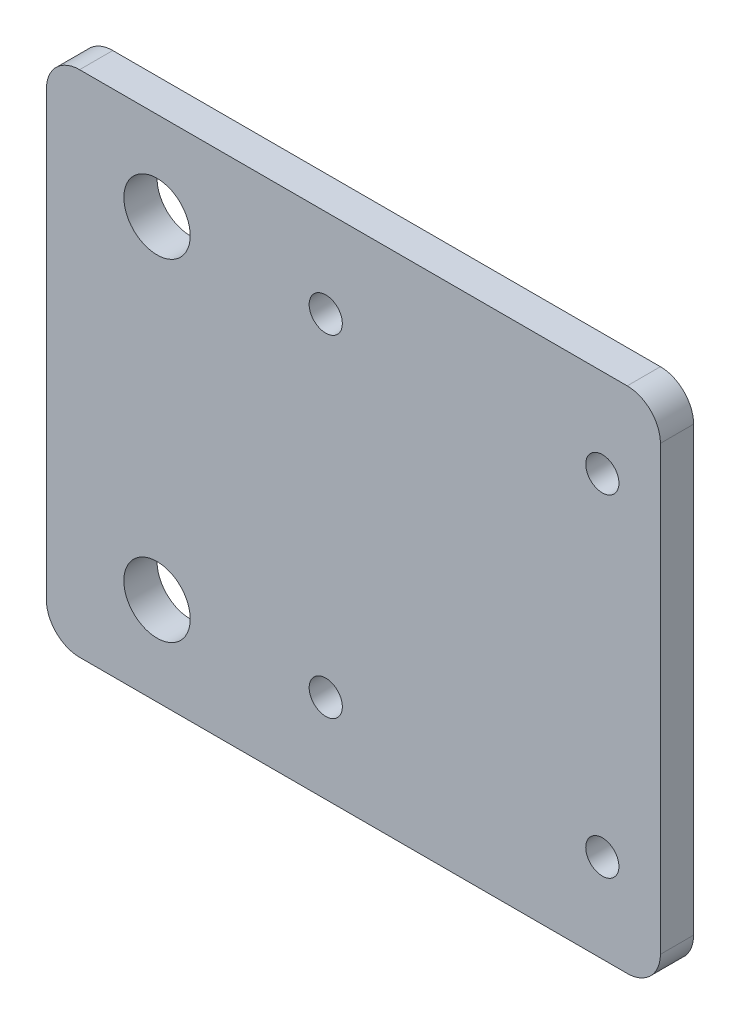
ISO-10303-21;
HEADER;
FILE_DESCRIPTION(('STEP AP214'),'2;1');
FILE_NAME('part.step','',(''),(''),'','','');
FILE_SCHEMA(('AUTOMOTIVE_DESIGN { 1 0 10303 214 1 1 1 1 }'));
ENDSEC;
DATA;
#1=APPLICATION_CONTEXT('core data for automotive mechanical design processes');
#2=APPLICATION_PROTOCOL_DEFINITION('international standard','automotive_design',2000,#1);
#3=PRODUCT_CONTEXT('',#1,'mechanical');
#4=PRODUCT('Part','Part','',(#3));
#5=PRODUCT_RELATED_PRODUCT_CATEGORY('part','',(#4));
#6=PRODUCT_DEFINITION_FORMATION('','',#4);
#7=PRODUCT_DEFINITION_CONTEXT('part definition',#1,'design');
#8=PRODUCT_DEFINITION('design','',#6,#7);
#9=PRODUCT_DEFINITION_SHAPE('','',#8);
#10=(LENGTH_UNIT() NAMED_UNIT(*) SI_UNIT(.MILLI.,.METRE.));
#11=(NAMED_UNIT(*) PLANE_ANGLE_UNIT() SI_UNIT($,.RADIAN.));
#12=(NAMED_UNIT(*) SI_UNIT($,.STERADIAN.) SOLID_ANGLE_UNIT());
#13=UNCERTAINTY_MEASURE_WITH_UNIT(LENGTH_MEASURE(1.E-05),#10,'distance_accuracy_value','');
#14=(GEOMETRIC_REPRESENTATION_CONTEXT(3) GLOBAL_UNCERTAINTY_ASSIGNED_CONTEXT((#13)) GLOBAL_UNIT_ASSIGNED_CONTEXT((#10,
#11,#12)) REPRESENTATION_CONTEXT('',''));
#15=CARTESIAN_POINT('',(0.,0.,0.));
#16=DIRECTION('',(0.,0.,1.));
#17=DIRECTION('',(1.,0.,0.));
#18=AXIS2_PLACEMENT_3D('',#15,#16,#17);
#19=CARTESIAN_POINT('',(4.46441751946896,26.2513791285018,3.));
#20=DIRECTION('',(0.,0.,-1.));
#21=DIRECTION('',(-1.,0.,0.));
#22=AXIS2_PLACEMENT_3D('',#19,#20,#21);
#23=PLANE('',#22);
#24=CARTESIAN_POINT('',(4.46441751946896,26.2513791285018,3.));
#25=DIRECTION('',(0.,0.,1.));
#26=DIRECTION('',(-1.,0.,0.));
#27=AXIS2_PLACEMENT_3D('',#24,#25,#26);
#28=CIRCLE('',#27,3.);
#29=CARTESIAN_POINT('',(4.46441751946898,29.2513791285018,3.));
#30=VERTEX_POINT('',#29);
#31=CARTESIAN_POINT('',(1.46441751946896,26.2513791285018,3.));
#32=VERTEX_POINT('',#31);
#33=EDGE_CURVE('E153',#30,#32,#28,.T.);
#34=ORIENTED_EDGE('',*,*,#33,.T.);
#35=DIRECTION('',(0.,-1.,0.));
#36=VECTOR('',#35,1.);
#37=CARTESIAN_POINT('',(1.46441751946896,26.2513791285018,3.));
#38=LINE('',#37,#36);
#39=CARTESIAN_POINT('',(1.46441751946897,-13.7486208714982,3.));
#40=VERTEX_POINT('',#39);
#41=EDGE_CURVE('E101',#32,#40,#38,.T.);
#42=ORIENTED_EDGE('',*,*,#41,.T.);
#43=CARTESIAN_POINT('',(4.46441751946897,-13.7486208714982,3.));
#44=DIRECTION('',(0.,0.,1.));
#45=DIRECTION('',(1.,0.,0.));
#46=AXIS2_PLACEMENT_3D('',#43,#44,#45);
#47=CIRCLE('',#46,3.);
#48=CARTESIAN_POINT('',(4.46441751946897,-16.7486208714982,3.));
#49=VERTEX_POINT('',#48);
#50=EDGE_CURVE('E168',#40,#49,#47,.T.);
#51=ORIENTED_EDGE('',*,*,#50,.T.);
#52=DIRECTION('',(1.,0.,0.));
#53=VECTOR('',#52,1.);
#54=CARTESIAN_POINT('',(4.46441751946897,-16.7486208714982,3.));
#55=LINE('',#54,#53);
#56=CARTESIAN_POINT('',(53.9644175194689,-16.7486208714982,3.));
#57=VERTEX_POINT('',#56);
#58=EDGE_CURVE('E181',#49,#57,#55,.T.);
#59=ORIENTED_EDGE('',*,*,#58,.T.);
#60=CARTESIAN_POINT('',(53.964417519469,-13.7486208714982,3.));
#61=DIRECTION('',(0.,0.,1.));
#62=DIRECTION('',(1.,0.,0.));
#63=AXIS2_PLACEMENT_3D('',#60,#61,#62);
#64=CIRCLE('',#63,3.);
#65=CARTESIAN_POINT('',(56.964417519469,-13.7486208714982,3.));
#66=VERTEX_POINT('',#65);
#67=EDGE_CURVE('E120',#57,#66,#64,.T.);
#68=ORIENTED_EDGE('',*,*,#67,.T.);
#69=DIRECTION('',(0.,1.,0.));
#70=VECTOR('',#69,1.);
#71=CARTESIAN_POINT('',(56.964417519469,-13.7486208714982,3.));
#72=LINE('',#71,#70);
#73=CARTESIAN_POINT('',(56.964417519469,26.2513791285018,3.));
#74=VERTEX_POINT('',#73);
#75=EDGE_CURVE('E114',#66,#74,#72,.T.);
#76=ORIENTED_EDGE('',*,*,#75,.T.);
#77=CARTESIAN_POINT('',(53.964417519469,26.2513791285018,3.));
#78=DIRECTION('',(0.,0.,1.));
#79=DIRECTION('',(1.,0.,0.));
#80=AXIS2_PLACEMENT_3D('',#77,#78,#79);
#81=CIRCLE('',#80,3.);
#82=CARTESIAN_POINT('',(53.9644175194689,29.2513791285018,3.));
#83=VERTEX_POINT('',#82);
#84=EDGE_CURVE('E118',#74,#83,#81,.T.);
#85=ORIENTED_EDGE('',*,*,#84,.T.);
#86=DIRECTION('',(-1.,0.,0.));
#87=VECTOR('',#86,1.);
#88=CARTESIAN_POINT('',(53.9644175194689,29.2513791285018,3.));
#89=LINE('',#88,#87);
#90=EDGE_CURVE('E58',#83,#30,#89,.T.);
#91=ORIENTED_EDGE('',*,*,#90,.T.);
#92=EDGE_LOOP('',(#34,#42,#51,#59,#68,#76,#85,#91));
#93=FACE_BOUND('',#92,.T.);
#94=CARTESIAN_POINT('',(51.714417519469,21.2513791285018,3.));
#95=DIRECTION('',(0.,0.,1.));
#96=DIRECTION('',(1.,0.,0.));
#97=AXIS2_PLACEMENT_3D('',#94,#95,#96);
#98=CIRCLE('',#97,1.5);
#99=CARTESIAN_POINT('',(53.214417519469,21.2513791285018,3.));
#100=VERTEX_POINT('',#99);
#101=EDGE_CURVE('E142',#100,#100,#98,.T.);
#102=ORIENTED_EDGE('',*,*,#101,.F.);
#103=EDGE_LOOP('',(#102));
#104=FACE_BOUND('',#103,.T.);
#105=CARTESIAN_POINT('',(26.714417519469,21.2513791285018,3.));
#106=DIRECTION('',(0.,0.,1.));
#107=DIRECTION('',(1.,0.,0.));
#108=AXIS2_PLACEMENT_3D('',#105,#106,#107);
#109=CIRCLE('',#108,1.5);
#110=CARTESIAN_POINT('',(28.214417519469,21.2513791285018,3.));
#111=VERTEX_POINT('',#110);
#112=EDGE_CURVE('E190',#111,#111,#109,.T.);
#113=ORIENTED_EDGE('',*,*,#112,.F.);
#114=EDGE_LOOP('',(#113));
#115=FACE_BOUND('',#114,.T.);
#116=CARTESIAN_POINT('',(26.714417519469,-8.74862087149821,3.));
#117=DIRECTION('',(0.,0.,1.));
#118=DIRECTION('',(-1.,0.,0.));
#119=AXIS2_PLACEMENT_3D('',#116,#117,#118);
#120=CIRCLE('',#119,1.5);
#121=CARTESIAN_POINT('',(25.214417519469,-8.74862087149821,3.));
#122=VERTEX_POINT('',#121);
#123=EDGE_CURVE('E196',#122,#122,#120,.T.);
#124=ORIENTED_EDGE('',*,*,#123,.F.);
#125=EDGE_LOOP('',(#124));
#126=FACE_BOUND('',#125,.T.);
#127=CARTESIAN_POINT('',(51.714417519469,-8.74862087149821,3.));
#128=DIRECTION('',(0.,0.,1.));
#129=DIRECTION('',(-1.,0.,0.));
#130=AXIS2_PLACEMENT_3D('',#127,#128,#129);
#131=CIRCLE('',#130,1.5);
#132=CARTESIAN_POINT('',(50.214417519469,-8.74862087149821,3.));
#133=VERTEX_POINT('',#132);
#134=EDGE_CURVE('E202',#133,#133,#131,.T.);
#135=ORIENTED_EDGE('',*,*,#134,.F.);
#136=EDGE_LOOP('',(#135));
#137=FACE_BOUND('',#136,.T.);
#138=CARTESIAN_POINT('',(11.464417519469,21.2513791285018,3.));
#139=DIRECTION('',(0.,0.,1.));
#140=DIRECTION('',(1.,0.,0.));
#141=AXIS2_PLACEMENT_3D('',#138,#139,#140);
#142=CIRCLE('',#141,3.);
#143=CARTESIAN_POINT('',(14.464417519469,21.2513791285018,3.));
#144=VERTEX_POINT('',#143);
#145=EDGE_CURVE('E208',#144,#144,#142,.T.);
#146=ORIENTED_EDGE('',*,*,#145,.F.);
#147=EDGE_LOOP('',(#146));
#148=FACE_BOUND('',#147,.T.);
#149=CARTESIAN_POINT('',(11.464417519469,-8.74862087149821,3.));
#150=DIRECTION('',(0.,0.,1.));
#151=DIRECTION('',(-1.,0.,0.));
#152=AXIS2_PLACEMENT_3D('',#149,#150,#151);
#153=CIRCLE('',#152,3.);
#154=CARTESIAN_POINT('',(8.46441751946896,-8.74862087149821,3.));
#155=VERTEX_POINT('',#154);
#156=EDGE_CURVE('E214',#155,#155,#153,.T.);
#157=ORIENTED_EDGE('',*,*,#156,.F.);
#158=EDGE_LOOP('',(#157));
#159=FACE_BOUND('',#158,.T.);
#160=ADVANCED_FACE('F41',(#93,#104,#115,#126,#137,#148,#159),#23,.F.);
#161=CARTESIAN_POINT('',(4.46441751946896,26.2513791285018,0.));
#162=DIRECTION('',(0.,0.,-1.));
#163=DIRECTION('',(-1.,0.,0.));
#164=AXIS2_PLACEMENT_3D('',#161,#162,#163);
#165=PLANE('',#164);
#166=CARTESIAN_POINT('',(11.464417519469,21.2513791285018,0.));
#167=DIRECTION('',(0.,0.,1.));
#168=DIRECTION('',(1.,0.,0.));
#169=AXIS2_PLACEMENT_3D('',#166,#167,#168);
#170=CIRCLE('',#169,3.);
#171=CARTESIAN_POINT('',(14.464417519469,21.2513791285018,0.));
#172=VERTEX_POINT('',#171);
#173=EDGE_CURVE('E211',#172,#172,#170,.T.);
#174=ORIENTED_EDGE('',*,*,#173,.T.);
#175=EDGE_LOOP('',(#174));
#176=FACE_BOUND('',#175,.T.);
#177=CARTESIAN_POINT('',(26.714417519469,-8.74862087149821,0.));
#178=DIRECTION('',(0.,0.,1.));
#179=DIRECTION('',(-1.,0.,0.));
#180=AXIS2_PLACEMENT_3D('',#177,#178,#179);
#181=CIRCLE('',#180,1.5);
#182=CARTESIAN_POINT('',(25.214417519469,-8.74862087149821,0.));
#183=VERTEX_POINT('',#182);
#184=EDGE_CURVE('E199',#183,#183,#181,.T.);
#185=ORIENTED_EDGE('',*,*,#184,.T.);
#186=EDGE_LOOP('',(#185));
#187=FACE_BOUND('',#186,.T.);
#188=CARTESIAN_POINT('',(51.714417519469,21.2513791285018,0.));
#189=DIRECTION('',(0.,0.,1.));
#190=DIRECTION('',(1.,0.,0.));
#191=AXIS2_PLACEMENT_3D('',#188,#189,#190);
#192=CIRCLE('',#191,1.5);
#193=CARTESIAN_POINT('',(53.214417519469,21.2513791285018,0.));
#194=VERTEX_POINT('',#193);
#195=EDGE_CURVE('E187',#194,#194,#192,.T.);
#196=ORIENTED_EDGE('',*,*,#195,.T.);
#197=EDGE_LOOP('',(#196));
#198=FACE_BOUND('',#197,.T.);
#199=CARTESIAN_POINT('',(4.46441751946896,26.2513791285018,0.));
#200=DIRECTION('',(0.,0.,1.));
#201=DIRECTION('',(-1.,0.,0.));
#202=AXIS2_PLACEMENT_3D('',#199,#200,#201);
#203=CIRCLE('',#202,3.);
#204=CARTESIAN_POINT('',(4.46441751946898,29.2513791285018,0.));
#205=VERTEX_POINT('',#204);
#206=CARTESIAN_POINT('',(1.46441751946896,26.2513791285018,0.));
#207=VERTEX_POINT('',#206);
#208=EDGE_CURVE('E138',#205,#207,#203,.T.);
#209=ORIENTED_EDGE('',*,*,#208,.F.);
#210=DIRECTION('',(-1.,0.,0.));
#211=VECTOR('',#210,1.);
#212=CARTESIAN_POINT('',(53.9644175194689,29.2513791285018,0.));
#213=LINE('',#212,#211);
#214=CARTESIAN_POINT('',(53.9644175194689,29.2513791285018,0.));
#215=VERTEX_POINT('',#214);
#216=EDGE_CURVE('E93',#215,#205,#213,.T.);
#217=ORIENTED_EDGE('',*,*,#216,.F.);
#218=CARTESIAN_POINT('',(53.964417519469,26.2513791285018,0.));
#219=DIRECTION('',(0.,0.,1.));
#220=DIRECTION('',(1.,0.,0.));
#221=AXIS2_PLACEMENT_3D('',#218,#219,#220);
#222=CIRCLE('',#221,3.);
#223=CARTESIAN_POINT('',(56.964417519469,26.2513791285018,0.));
#224=VERTEX_POINT('',#223);
#225=EDGE_CURVE('E87',#224,#215,#222,.T.);
#226=ORIENTED_EDGE('',*,*,#225,.F.);
#227=DIRECTION('',(0.,1.,0.));
#228=VECTOR('',#227,1.);
#229=CARTESIAN_POINT('',(56.964417519469,-13.7486208714982,0.));
#230=LINE('',#229,#228);
#231=CARTESIAN_POINT('',(56.964417519469,-13.7486208714982,0.));
#232=VERTEX_POINT('',#231);
#233=EDGE_CURVE('E128',#232,#224,#230,.T.);
#234=ORIENTED_EDGE('',*,*,#233,.F.);
#235=CARTESIAN_POINT('',(53.964417519469,-13.7486208714982,0.));
#236=DIRECTION('',(0.,0.,1.));
#237=DIRECTION('',(1.,0.,0.));
#238=AXIS2_PLACEMENT_3D('',#235,#236,#237);
#239=CIRCLE('',#238,3.);
#240=CARTESIAN_POINT('',(53.9644175194689,-16.7486208714982,0.));
#241=VERTEX_POINT('',#240);
#242=EDGE_CURVE('E148',#241,#232,#239,.T.);
#243=ORIENTED_EDGE('',*,*,#242,.F.);
#244=DIRECTION('',(1.,0.,0.));
#245=VECTOR('',#244,1.);
#246=CARTESIAN_POINT('',(4.46441751946897,-16.7486208714982,0.));
#247=LINE('',#246,#245);
#248=CARTESIAN_POINT('',(4.46441751946897,-16.7486208714982,0.));
#249=VERTEX_POINT('',#248);
#250=EDGE_CURVE('E146',#249,#241,#247,.T.);
#251=ORIENTED_EDGE('',*,*,#250,.F.);
#252=CARTESIAN_POINT('',(4.46441751946897,-13.7486208714982,0.));
#253=DIRECTION('',(0.,0.,1.));
#254=DIRECTION('',(1.,0.,0.));
#255=AXIS2_PLACEMENT_3D('',#252,#253,#254);
#256=CIRCLE('',#255,3.);
#257=CARTESIAN_POINT('',(1.46441751946897,-13.7486208714982,0.));
#258=VERTEX_POINT('',#257);
#259=EDGE_CURVE('E144',#258,#249,#256,.T.);
#260=ORIENTED_EDGE('',*,*,#259,.F.);
#261=DIRECTION('',(0.,-1.,0.));
#262=VECTOR('',#261,1.);
#263=CARTESIAN_POINT('',(1.46441751946896,26.2513791285018,0.));
#264=LINE('',#263,#262);
#265=EDGE_CURVE('E141',#207,#258,#264,.T.);
#266=ORIENTED_EDGE('',*,*,#265,.F.);
#267=EDGE_LOOP('',(#209,#217,#226,#234,#243,#251,#260,#266));
#268=FACE_BOUND('',#267,.T.);
#269=CARTESIAN_POINT('',(26.714417519469,21.2513791285018,0.));
#270=DIRECTION('',(0.,0.,1.));
#271=DIRECTION('',(1.,0.,0.));
#272=AXIS2_PLACEMENT_3D('',#269,#270,#271);
#273=CIRCLE('',#272,1.5);
#274=CARTESIAN_POINT('',(28.214417519469,21.2513791285018,0.));
#275=VERTEX_POINT('',#274);
#276=EDGE_CURVE('E193',#275,#275,#273,.T.);
#277=ORIENTED_EDGE('',*,*,#276,.T.);
#278=EDGE_LOOP('',(#277));
#279=FACE_BOUND('',#278,.T.);
#280=CARTESIAN_POINT('',(51.714417519469,-8.74862087149821,0.));
#281=DIRECTION('',(0.,0.,1.));
#282=DIRECTION('',(-1.,0.,0.));
#283=AXIS2_PLACEMENT_3D('',#280,#281,#282);
#284=CIRCLE('',#283,1.5);
#285=CARTESIAN_POINT('',(50.214417519469,-8.74862087149821,0.));
#286=VERTEX_POINT('',#285);
#287=EDGE_CURVE('E205',#286,#286,#284,.T.);
#288=ORIENTED_EDGE('',*,*,#287,.T.);
#289=EDGE_LOOP('',(#288));
#290=FACE_BOUND('',#289,.T.);
#291=CARTESIAN_POINT('',(11.464417519469,-8.74862087149821,0.));
#292=DIRECTION('',(0.,0.,1.));
#293=DIRECTION('',(-1.,0.,0.));
#294=AXIS2_PLACEMENT_3D('',#291,#292,#293);
#295=CIRCLE('',#294,3.);
#296=CARTESIAN_POINT('',(8.46441751946896,-8.74862087149821,0.));
#297=VERTEX_POINT('',#296);
#298=EDGE_CURVE('E217',#297,#297,#295,.T.);
#299=ORIENTED_EDGE('',*,*,#298,.T.);
#300=EDGE_LOOP('',(#299));
#301=FACE_BOUND('',#300,.T.);
#302=ADVANCED_FACE('F172',(#176,#187,#198,#268,#279,#290,#301),#165,.T.);
#303=CARTESIAN_POINT('',(4.46441751946896,26.2513791285018,3.));
#304=DIRECTION('',(0.,0.,-1.));
#305=DIRECTION('',(-1.,0.,0.));
#306=AXIS2_PLACEMENT_3D('',#303,#304,#305);
#307=CYLINDRICAL_SURFACE('',#306,3.);
#308=ORIENTED_EDGE('',*,*,#208,.T.);
#309=DIRECTION('',(0.,0.,-1.));
#310=VECTOR('',#309,1.);
#311=CARTESIAN_POINT('',(1.46441751946896,26.2513791285018,3.));
#312=LINE('',#311,#310);
#313=EDGE_CURVE('E11',#32,#207,#312,.T.);
#314=ORIENTED_EDGE('',*,*,#313,.F.);
#315=ORIENTED_EDGE('',*,*,#33,.F.);
#316=DIRECTION('',(0.,0.,-1.));
#317=VECTOR('',#316,1.);
#318=CARTESIAN_POINT('',(4.46441751946898,29.2513791285018,3.));
#319=LINE('',#318,#317);
#320=EDGE_CURVE('E134',#30,#205,#319,.T.);
#321=ORIENTED_EDGE('',*,*,#320,.T.);
#322=EDGE_LOOP('',(#308,#314,#315,#321));
#323=FACE_BOUND('',#322,.T.);
#324=ADVANCED_FACE('F43',(#323),#307,.T.);
#325=CARTESIAN_POINT('',(1.46441751946896,26.2513791285018,3.));
#326=DIRECTION('',(1.,0.,0.));
#327=DIRECTION('',(0.,1.,0.));
#328=AXIS2_PLACEMENT_3D('',#325,#326,#327);
#329=PLANE('',#328);
#330=ORIENTED_EDGE('',*,*,#265,.T.);
#331=DIRECTION('',(0.,0.,-1.));
#332=VECTOR('',#331,1.);
#333=CARTESIAN_POINT('',(1.46441751946897,-13.7486208714982,3.));
#334=LINE('',#333,#332);
#335=EDGE_CURVE('E50',#40,#258,#334,.T.);
#336=ORIENTED_EDGE('',*,*,#335,.F.);
#337=ORIENTED_EDGE('',*,*,#41,.F.);
#338=ORIENTED_EDGE('',*,*,#313,.T.);
#339=EDGE_LOOP('',(#330,#336,#337,#338));
#340=FACE_BOUND('',#339,.T.);
#341=ADVANCED_FACE('F249',(#340),#329,.F.);
#342=CARTESIAN_POINT('',(4.46441751946897,-13.7486208714982,3.));
#343=DIRECTION('',(0.,0.,-1.));
#344=DIRECTION('',(-1.,0.,0.));
#345=AXIS2_PLACEMENT_3D('',#342,#343,#344);
#346=CYLINDRICAL_SURFACE('',#345,3.);
#347=ORIENTED_EDGE('',*,*,#259,.T.);
#348=DIRECTION('',(0.,0.,-1.));
#349=VECTOR('',#348,1.);
#350=CARTESIAN_POINT('',(4.46441751946897,-16.7486208714982,3.));
#351=LINE('',#350,#349);
#352=EDGE_CURVE('E160',#49,#249,#351,.T.);
#353=ORIENTED_EDGE('',*,*,#352,.F.);
#354=ORIENTED_EDGE('',*,*,#50,.F.);
#355=ORIENTED_EDGE('',*,*,#335,.T.);
#356=EDGE_LOOP('',(#347,#353,#354,#355));
#357=FACE_BOUND('',#356,.T.);
#358=ADVANCED_FACE('F166',(#357),#346,.T.);
#359=CARTESIAN_POINT('',(4.46441751946897,-16.7486208714982,3.));
#360=DIRECTION('',(0.,1.,0.));
#361=DIRECTION('',(0.,0.,1.));
#362=AXIS2_PLACEMENT_3D('',#359,#360,#361);
#363=PLANE('',#362);
#364=ORIENTED_EDGE('',*,*,#250,.T.);
#365=DIRECTION('',(0.,0.,-1.));
#366=VECTOR('',#365,1.);
#367=CARTESIAN_POINT('',(53.9644175194689,-16.7486208714982,3.));
#368=LINE('',#367,#366);
#369=EDGE_CURVE('E157',#57,#241,#368,.T.);
#370=ORIENTED_EDGE('',*,*,#369,.F.);
#371=ORIENTED_EDGE('',*,*,#58,.F.);
#372=ORIENTED_EDGE('',*,*,#352,.T.);
#373=EDGE_LOOP('',(#364,#370,#371,#372));
#374=FACE_BOUND('',#373,.T.);
#375=ADVANCED_FACE('F177',(#374),#363,.F.);
#376=CARTESIAN_POINT('',(53.964417519469,-13.7486208714982,3.));
#377=DIRECTION('',(0.,0.,-1.));
#378=DIRECTION('',(-1.,0.,0.));
#379=AXIS2_PLACEMENT_3D('',#376,#377,#378);
#380=CYLINDRICAL_SURFACE('',#379,3.);
#381=ORIENTED_EDGE('',*,*,#242,.T.);
#382=DIRECTION('',(0.,0.,-1.));
#383=VECTOR('',#382,1.);
#384=CARTESIAN_POINT('',(56.964417519469,-13.7486208714982,3.));
#385=LINE('',#384,#383);
#386=EDGE_CURVE('E129',#66,#232,#385,.T.);
#387=ORIENTED_EDGE('',*,*,#386,.F.);
#388=ORIENTED_EDGE('',*,*,#67,.F.);
#389=ORIENTED_EDGE('',*,*,#369,.T.);
#390=EDGE_LOOP('',(#381,#387,#388,#389));
#391=FACE_BOUND('',#390,.T.);
#392=ADVANCED_FACE('F180',(#391),#380,.T.);
#393=CARTESIAN_POINT('',(56.964417519469,-13.7486208714982,3.));
#394=DIRECTION('',(-1.,0.,0.));
#395=DIRECTION('',(0.,-1.,0.));
#396=AXIS2_PLACEMENT_3D('',#393,#394,#395);
#397=PLANE('',#396);
#398=ORIENTED_EDGE('',*,*,#233,.T.);
#399=DIRECTION('',(0.,0.,-1.));
#400=VECTOR('',#399,1.);
#401=CARTESIAN_POINT('',(56.964417519469,26.2513791285018,3.));
#402=LINE('',#401,#400);
#403=EDGE_CURVE('E125',#74,#224,#402,.T.);
#404=ORIENTED_EDGE('',*,*,#403,.F.);
#405=ORIENTED_EDGE('',*,*,#75,.F.);
#406=ORIENTED_EDGE('',*,*,#386,.T.);
#407=EDGE_LOOP('',(#398,#404,#405,#406));
#408=FACE_BOUND('',#407,.T.);
#409=ADVANCED_FACE('F126',(#408),#397,.F.);
#410=CARTESIAN_POINT('',(53.964417519469,26.2513791285018,3.));
#411=DIRECTION('',(0.,0.,-1.));
#412=DIRECTION('',(-1.,0.,0.));
#413=AXIS2_PLACEMENT_3D('',#410,#411,#412);
#414=CYLINDRICAL_SURFACE('',#413,3.);
#415=ORIENTED_EDGE('',*,*,#225,.T.);
#416=DIRECTION('',(0.,0.,-1.));
#417=VECTOR('',#416,1.);
#418=CARTESIAN_POINT('',(53.9644175194689,29.2513791285018,3.));
#419=LINE('',#418,#417);
#420=EDGE_CURVE('E130',#83,#215,#419,.T.);
#421=ORIENTED_EDGE('',*,*,#420,.F.);
#422=ORIENTED_EDGE('',*,*,#84,.F.);
#423=ORIENTED_EDGE('',*,*,#403,.T.);
#424=EDGE_LOOP('',(#415,#421,#422,#423));
#425=FACE_BOUND('',#424,.T.);
#426=ADVANCED_FACE('F132',(#425),#414,.T.);
#427=CARTESIAN_POINT('',(53.9644175194689,29.2513791285018,3.));
#428=DIRECTION('',(0.,-1.,0.));
#429=DIRECTION('',(1.,0.,0.));
#430=AXIS2_PLACEMENT_3D('',#427,#428,#429);
#431=PLANE('',#430);
#432=ORIENTED_EDGE('',*,*,#216,.T.);
#433=ORIENTED_EDGE('',*,*,#320,.F.);
#434=ORIENTED_EDGE('',*,*,#90,.F.);
#435=ORIENTED_EDGE('',*,*,#420,.T.);
#436=EDGE_LOOP('',(#432,#433,#434,#435));
#437=FACE_BOUND('',#436,.T.);
#438=ADVANCED_FACE('F237',(#437),#431,.F.);
#439=CARTESIAN_POINT('',(51.714417519469,21.2513791285018,3.));
#440=DIRECTION('',(0.,0.,-1.));
#441=DIRECTION('',(-1.,0.,0.));
#442=AXIS2_PLACEMENT_3D('',#439,#440,#441);
#443=CYLINDRICAL_SURFACE('',#442,1.5);
#444=ORIENTED_EDGE('',*,*,#101,.T.);
#445=EDGE_LOOP('',(#444));
#446=FACE_BOUND('',#445,.T.);
#447=ORIENTED_EDGE('',*,*,#195,.F.);
#448=EDGE_LOOP('',(#447));
#449=FACE_BOUND('',#448,.T.);
#450=ADVANCED_FACE('F234',(#446,#449),#443,.F.);
#451=CARTESIAN_POINT('',(26.714417519469,21.2513791285018,3.));
#452=DIRECTION('',(0.,0.,-1.));
#453=DIRECTION('',(-1.,0.,0.));
#454=AXIS2_PLACEMENT_3D('',#451,#452,#453);
#455=CYLINDRICAL_SURFACE('',#454,1.5);
#456=ORIENTED_EDGE('',*,*,#112,.T.);
#457=EDGE_LOOP('',(#456));
#458=FACE_BOUND('',#457,.T.);
#459=ORIENTED_EDGE('',*,*,#276,.F.);
#460=EDGE_LOOP('',(#459));
#461=FACE_BOUND('',#460,.T.);
#462=ADVANCED_FACE('F313',(#458,#461),#455,.F.);
#463=CARTESIAN_POINT('',(26.714417519469,-8.74862087149821,3.));
#464=DIRECTION('',(0.,0.,-1.));
#465=DIRECTION('',(-1.,0.,0.));
#466=AXIS2_PLACEMENT_3D('',#463,#464,#465);
#467=CYLINDRICAL_SURFACE('',#466,1.5);
#468=ORIENTED_EDGE('',*,*,#123,.T.);
#469=EDGE_LOOP('',(#468));
#470=FACE_BOUND('',#469,.T.);
#471=ORIENTED_EDGE('',*,*,#184,.F.);
#472=EDGE_LOOP('',(#471));
#473=FACE_BOUND('',#472,.T.);
#474=ADVANCED_FACE('F321',(#470,#473),#467,.F.);
#475=CARTESIAN_POINT('',(51.714417519469,-8.74862087149821,3.));
#476=DIRECTION('',(0.,0.,-1.));
#477=DIRECTION('',(-1.,0.,0.));
#478=AXIS2_PLACEMENT_3D('',#475,#476,#477);
#479=CYLINDRICAL_SURFACE('',#478,1.5);
#480=ORIENTED_EDGE('',*,*,#134,.T.);
#481=EDGE_LOOP('',(#480));
#482=FACE_BOUND('',#481,.T.);
#483=ORIENTED_EDGE('',*,*,#287,.F.);
#484=EDGE_LOOP('',(#483));
#485=FACE_BOUND('',#484,.T.);
#486=ADVANCED_FACE('F329',(#482,#485),#479,.F.);
#487=CARTESIAN_POINT('',(11.464417519469,21.2513791285018,3.));
#488=DIRECTION('',(0.,0.,-1.));
#489=DIRECTION('',(-1.,0.,0.));
#490=AXIS2_PLACEMENT_3D('',#487,#488,#489);
#491=CYLINDRICAL_SURFACE('',#490,3.);
#492=ORIENTED_EDGE('',*,*,#145,.T.);
#493=EDGE_LOOP('',(#492));
#494=FACE_BOUND('',#493,.T.);
#495=ORIENTED_EDGE('',*,*,#173,.F.);
#496=EDGE_LOOP('',(#495));
#497=FACE_BOUND('',#496,.T.);
#498=ADVANCED_FACE('F338',(#494,#497),#491,.F.);
#499=CARTESIAN_POINT('',(11.464417519469,-8.74862087149821,3.));
#500=DIRECTION('',(0.,0.,-1.));
#501=DIRECTION('',(-1.,0.,0.));
#502=AXIS2_PLACEMENT_3D('',#499,#500,#501);
#503=CYLINDRICAL_SURFACE('',#502,3.);
#504=ORIENTED_EDGE('',*,*,#156,.T.);
#505=EDGE_LOOP('',(#504));
#506=FACE_BOUND('',#505,.T.);
#507=ORIENTED_EDGE('',*,*,#298,.F.);
#508=EDGE_LOOP('',(#507));
#509=FACE_BOUND('',#508,.T.);
#510=ADVANCED_FACE('F223',(#506,#509),#503,.F.);
#511=CLOSED_SHELL('',(#160,#302,#324,#341,#358,#375,#392,#409,#426,#438,#450,#462,#474,#486,
#498,#510));
#512=MANIFOLD_SOLID_BREP('B2',#511);
#513=ADVANCED_BREP_SHAPE_REPRESENTATION('',(#18,#512),#14);
#514=SHAPE_DEFINITION_REPRESENTATION(#9,#513);
ENDSEC;
END-ISO-10303-21;
